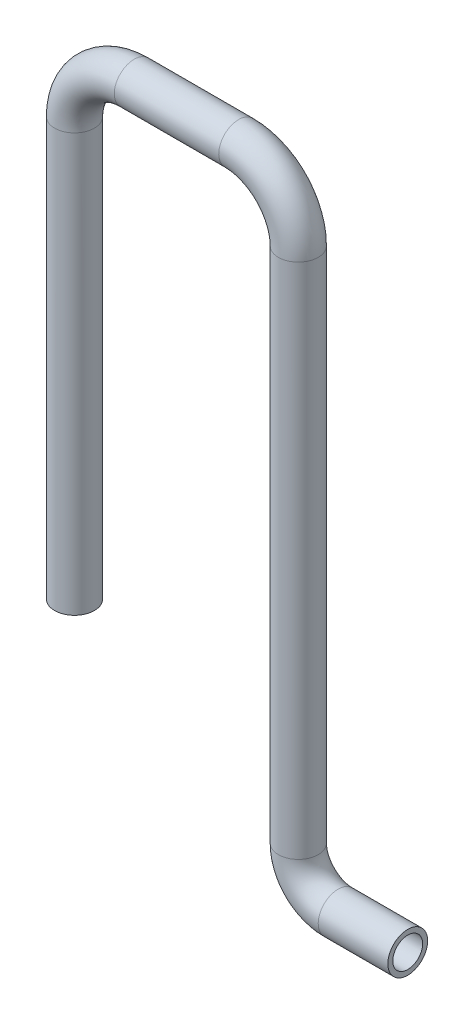
ISO-10303-21;
HEADER;
FILE_DESCRIPTION(('STEP AP214'),'2;1');
FILE_NAME('part.step','',(''),(''),'','','');
FILE_SCHEMA(('AUTOMOTIVE_DESIGN { 1 0 10303 214 1 1 1 1 }'));
ENDSEC;
DATA;
#1=APPLICATION_CONTEXT('core data for automotive mechanical design processes');
#2=APPLICATION_PROTOCOL_DEFINITION('international standard','automotive_design',2000,#1);
#3=PRODUCT_CONTEXT('',#1,'mechanical');
#4=PRODUCT('Part','Part','',(#3));
#5=PRODUCT_RELATED_PRODUCT_CATEGORY('part','',(#4));
#6=PRODUCT_DEFINITION_FORMATION('','',#4);
#7=PRODUCT_DEFINITION_CONTEXT('part definition',#1,'design');
#8=PRODUCT_DEFINITION('design','',#6,#7);
#9=PRODUCT_DEFINITION_SHAPE('','',#8);
#10=(LENGTH_UNIT() NAMED_UNIT(*) SI_UNIT(.MILLI.,.METRE.));
#11=(NAMED_UNIT(*) PLANE_ANGLE_UNIT() SI_UNIT($,.RADIAN.));
#12=(NAMED_UNIT(*) SI_UNIT($,.STERADIAN.) SOLID_ANGLE_UNIT());
#13=UNCERTAINTY_MEASURE_WITH_UNIT(LENGTH_MEASURE(1.E-05),#10,'distance_accuracy_value','');
#14=(GEOMETRIC_REPRESENTATION_CONTEXT(3) GLOBAL_UNCERTAINTY_ASSIGNED_CONTEXT((#13)) GLOBAL_UNIT_ASSIGNED_CONTEXT((#10,
#11,#12)) REPRESENTATION_CONTEXT('',''));
#15=CARTESIAN_POINT('',(0.,0.,0.));
#16=DIRECTION('',(0.,0.,1.));
#17=DIRECTION('',(1.,0.,0.));
#18=AXIS2_PLACEMENT_3D('',#15,#16,#17);
#19=CARTESIAN_POINT('',(-145.,44.,95.));
#20=DIRECTION('',(0.,-1.,0.));
#21=DIRECTION('',(0.,0.,1.));
#22=AXIS2_PLACEMENT_3D('',#19,#20,#21);
#23=PLANE('',#22);
#24=CARTESIAN_POINT('',(-145.,44.,95.));
#25=DIRECTION('',(0.,-1.,0.));
#26=DIRECTION('',(0.,0.,1.));
#27=AXIS2_PLACEMENT_3D('',#24,#25,#26);
#28=CIRCLE('',#27,3.);
#29=CARTESIAN_POINT('',(-145.,44.,98.));
#30=VERTEX_POINT('',#29);
#31=EDGE_CURVE('E263',#30,#30,#28,.T.);
#32=ORIENTED_EDGE('',*,*,#31,.F.);
#33=EDGE_LOOP('',(#32));
#34=FACE_BOUND('',#33,.T.);
#35=CARTESIAN_POINT('',(-145.,44.,95.));
#36=DIRECTION('',(0.,-1.,0.));
#37=DIRECTION('',(0.,0.,-1.));
#38=AXIS2_PLACEMENT_3D('',#35,#36,#37);
#39=CIRCLE('',#38,4.);
#40=CARTESIAN_POINT('',(-145.,44.,91.));
#41=VERTEX_POINT('',#40);
#42=EDGE_CURVE('E75',#41,#41,#39,.T.);
#43=ORIENTED_EDGE('',*,*,#42,.T.);
#44=EDGE_LOOP('',(#43));
#45=FACE_BOUND('',#44,.T.);
#46=ADVANCED_FACE('F52',(#34,#45),#23,.T.);
#47=CARTESIAN_POINT('',(-78.,16.,95.));
#48=DIRECTION('',(-1.,0.,0.));
#49=DIRECTION('',(0.,0.,1.));
#50=AXIS2_PLACEMENT_3D('',#47,#48,#49);
#51=PLANE('',#50);
#52=CARTESIAN_POINT('',(-78.,16.,95.));
#53=DIRECTION('',(-1.,0.,0.));
#54=DIRECTION('',(0.,0.,1.));
#55=AXIS2_PLACEMENT_3D('',#52,#53,#54);
#56=CIRCLE('',#55,3.);
#57=CARTESIAN_POINT('',(-78.,16.,98.));
#58=VERTEX_POINT('',#57);
#59=EDGE_CURVE('E73',#58,#58,#56,.T.);
#60=ORIENTED_EDGE('',*,*,#59,.T.);
#61=EDGE_LOOP('',(#60));
#62=FACE_BOUND('',#61,.T.);
#63=CARTESIAN_POINT('',(-78.,16.,95.));
#64=DIRECTION('',(-1.,0.,0.));
#65=DIRECTION('',(0.,0.,1.));
#66=AXIS2_PLACEMENT_3D('',#63,#64,#65);
#67=CIRCLE('',#66,4.);
#68=CARTESIAN_POINT('',(-78.,16.,99.));
#69=VERTEX_POINT('',#68);
#70=EDGE_CURVE('E11',#69,#69,#67,.T.);
#71=ORIENTED_EDGE('',*,*,#70,.F.);
#72=EDGE_LOOP('',(#71));
#73=FACE_BOUND('',#72,.T.);
#74=ADVANCED_FACE('F149',(#62,#73),#51,.F.);
#75=CARTESIAN_POINT('',(-145.,44.,95.));
#76=DIRECTION('',(0.,1.,0.));
#77=DIRECTION('',(0.,0.,1.));
#78=AXIS2_PLACEMENT_3D('',#75,#76,#77);
#79=CYLINDRICAL_SURFACE('',#78,4.);
#80=CARTESIAN_POINT('',(-145.,128.,95.));
#81=DIRECTION('',(0.,1.,0.));
#82=DIRECTION('',(0.,0.,1.));
#83=AXIS2_PLACEMENT_3D('',#80,#81,#82);
#84=CIRCLE('',#83,4.);
#85=CARTESIAN_POINT('',(-149.,128.,95.));
#86=VERTEX_POINT('',#85);
#87=EDGE_CURVE('E74',#86,#86,#84,.F.);
#88=ORIENTED_EDGE('',*,*,#87,.T.);
#89=EDGE_LOOP('',(#88));
#90=FACE_BOUND('',#89,.T.);
#91=ORIENTED_EDGE('',*,*,#42,.F.);
#92=EDGE_LOOP('',(#91));
#93=FACE_BOUND('',#92,.T.);
#94=ADVANCED_FACE('F155',(#90,#93),#79,.T.);
#95=CARTESIAN_POINT('',(-133.,128.,95.));
#96=DIRECTION('',(0.,0.,-1.));
#97=DIRECTION('',(-1.,0.,0.));
#98=AXIS2_PLACEMENT_3D('',#95,#96,#97);
#99=TOROIDAL_SURFACE('',#98,12.,4.);
#100=CARTESIAN_POINT('',(-133.,140.,95.));
#101=DIRECTION('',(-1.,0.,0.));
#102=DIRECTION('',(0.,-1.,0.));
#103=AXIS2_PLACEMENT_3D('',#100,#101,#102);
#104=CIRCLE('',#103,4.);
#105=CARTESIAN_POINT('',(-133.,144.,95.));
#106=VERTEX_POINT('',#105);
#107=EDGE_CURVE('E78',#106,#106,#104,.T.);
#108=CARTESIAN_POINT('',(-133.,128.,95.));
#109=DIRECTION('',(0.,0.,-1.));
#110=DIRECTION('',(-1.,0.,0.));
#111=AXIS2_PLACEMENT_3D('',#108,#109,#110);
#112=CIRCLE('',#111,16.);
#113=EDGE_CURVE('',#86,#106,#112,.T.);
#114=ORIENTED_EDGE('',*,*,#87,.F.);
#115=ORIENTED_EDGE('',*,*,#107,.T.);
#116=ORIENTED_EDGE('',*,*,#113,.T.);
#117=ORIENTED_EDGE('',*,*,#113,.F.);
#118=EDGE_LOOP('',(#114,#116,#115,#117));
#119=FACE_BOUND('',#118,.T.);
#120=ADVANCED_FACE('F158',(#119),#99,.T.);
#121=CARTESIAN_POINT('',(-133.,140.,95.));
#122=DIRECTION('',(1.,0.,0.));
#123=DIRECTION('',(0.,0.,-1.));
#124=AXIS2_PLACEMENT_3D('',#121,#122,#123);
#125=CYLINDRICAL_SURFACE('',#124,4.);
#126=CARTESIAN_POINT('',(-112.,140.,95.));
#127=DIRECTION('',(1.,0.,0.));
#128=DIRECTION('',(0.,0.,-1.));
#129=AXIS2_PLACEMENT_3D('',#126,#127,#128);
#130=CIRCLE('',#129,4.);
#131=CARTESIAN_POINT('',(-112.,144.,95.));
#132=VERTEX_POINT('',#131);
#133=EDGE_CURVE('E91',#132,#132,#130,.F.);
#134=ORIENTED_EDGE('',*,*,#133,.T.);
#135=EDGE_LOOP('',(#134));
#136=FACE_BOUND('',#135,.T.);
#137=ORIENTED_EDGE('',*,*,#107,.F.);
#138=EDGE_LOOP('',(#137));
#139=FACE_BOUND('',#138,.T.);
#140=ADVANCED_FACE('F109',(#136,#139),#125,.T.);
#141=CARTESIAN_POINT('',(-112.,128.,95.));
#142=DIRECTION('',(0.,0.,-1.));
#143=DIRECTION('',(-1.,0.,0.));
#144=AXIS2_PLACEMENT_3D('',#141,#142,#143);
#145=TOROIDAL_SURFACE('',#144,12.,4.);
#146=CARTESIAN_POINT('',(-100.,128.,95.));
#147=DIRECTION('',(0.,1.,0.));
#148=DIRECTION('',(-1.,0.,0.));
#149=AXIS2_PLACEMENT_3D('',#146,#147,#148);
#150=CIRCLE('',#149,4.);
#151=CARTESIAN_POINT('',(-96.,128.,95.));
#152=VERTEX_POINT('',#151);
#153=EDGE_CURVE('E67',#152,#152,#150,.T.);
#154=CARTESIAN_POINT('',(-112.,128.,95.));
#155=DIRECTION('',(0.,0.,-1.));
#156=DIRECTION('',(-1.,0.,0.));
#157=AXIS2_PLACEMENT_3D('',#154,#155,#156);
#158=CIRCLE('',#157,16.);
#159=EDGE_CURVE('',#132,#152,#158,.T.);
#160=ORIENTED_EDGE('',*,*,#133,.F.);
#161=ORIENTED_EDGE('',*,*,#153,.T.);
#162=ORIENTED_EDGE('',*,*,#159,.T.);
#163=ORIENTED_EDGE('',*,*,#159,.F.);
#164=EDGE_LOOP('',(#160,#162,#161,#163));
#165=FACE_BOUND('',#164,.T.);
#166=ADVANCED_FACE('F98',(#165),#145,.T.);
#167=CARTESIAN_POINT('',(-100.,128.,95.));
#168=DIRECTION('',(0.,-1.,0.));
#169=DIRECTION('',(0.,0.,-1.));
#170=AXIS2_PLACEMENT_3D('',#167,#168,#169);
#171=CYLINDRICAL_SURFACE('',#170,4.);
#172=CARTESIAN_POINT('',(-100.,24.,95.));
#173=DIRECTION('',(0.,-1.,0.));
#174=DIRECTION('',(0.,0.,-1.));
#175=AXIS2_PLACEMENT_3D('',#172,#173,#174);
#176=CIRCLE('',#175,4.);
#177=CARTESIAN_POINT('',(-104.,24.,95.));
#178=VERTEX_POINT('',#177);
#179=EDGE_CURVE('E63',#178,#178,#176,.F.);
#180=ORIENTED_EDGE('',*,*,#179,.T.);
#181=EDGE_LOOP('',(#180));
#182=FACE_BOUND('',#181,.T.);
#183=ORIENTED_EDGE('',*,*,#153,.F.);
#184=EDGE_LOOP('',(#183));
#185=FACE_BOUND('',#184,.T.);
#186=ADVANCED_FACE('F101',(#182,#185),#171,.T.);
#187=CARTESIAN_POINT('',(-92.,24.,95.));
#188=DIRECTION('',(0.,0.,1.));
#189=DIRECTION('',(1.,0.,0.));
#190=AXIS2_PLACEMENT_3D('',#187,#188,#189);
#191=TOROIDAL_SURFACE('',#190,8.00000000000001,4.);
#192=CARTESIAN_POINT('',(-92.,16.,95.));
#193=DIRECTION('',(-1.,0.,0.));
#194=DIRECTION('',(0.,-1.,0.));
#195=AXIS2_PLACEMENT_3D('',#192,#193,#194);
#196=CIRCLE('',#195,4.);
#197=CARTESIAN_POINT('',(-92.,12.,95.));
#198=VERTEX_POINT('',#197);
#199=EDGE_CURVE('E58',#198,#198,#196,.T.);
#200=CARTESIAN_POINT('',(-92.,24.,95.));
#201=DIRECTION('',(0.,0.,1.));
#202=DIRECTION('',(1.,0.,0.));
#203=AXIS2_PLACEMENT_3D('',#200,#201,#202);
#204=CIRCLE('',#203,12.);
#205=EDGE_CURVE('',#178,#198,#204,.T.);
#206=ORIENTED_EDGE('',*,*,#179,.F.);
#207=ORIENTED_EDGE('',*,*,#199,.T.);
#208=ORIENTED_EDGE('',*,*,#205,.T.);
#209=ORIENTED_EDGE('',*,*,#205,.F.);
#210=EDGE_LOOP('',(#206,#208,#207,#209));
#211=FACE_BOUND('',#210,.T.);
#212=ADVANCED_FACE('F103',(#211),#191,.T.);
#213=CARTESIAN_POINT('',(-92.,16.,95.));
#214=DIRECTION('',(1.,0.,0.));
#215=DIRECTION('',(0.,0.,-1.));
#216=AXIS2_PLACEMENT_3D('',#213,#214,#215);
#217=CYLINDRICAL_SURFACE('',#216,4.);
#218=ORIENTED_EDGE('',*,*,#70,.T.);
#219=EDGE_LOOP('',(#218));
#220=FACE_BOUND('',#219,.T.);
#221=ORIENTED_EDGE('',*,*,#199,.F.);
#222=EDGE_LOOP('',(#221));
#223=FACE_BOUND('',#222,.T.);
#224=ADVANCED_FACE('F54',(#220,#223),#217,.T.);
#225=CARTESIAN_POINT('',(-145.,44.,95.));
#226=DIRECTION('',(0.,1.,0.));
#227=DIRECTION('',(0.,0.,1.));
#228=AXIS2_PLACEMENT_3D('',#225,#226,#227);
#229=CYLINDRICAL_SURFACE('',#228,3.);
#230=CARTESIAN_POINT('',(-145.,128.,95.));
#231=DIRECTION('',(0.,-1.,0.));
#232=DIRECTION('',(0.,0.,1.));
#233=AXIS2_PLACEMENT_3D('',#230,#231,#232);
#234=CIRCLE('',#233,3.);
#235=CARTESIAN_POINT('',(-148.,128.,95.));
#236=VERTEX_POINT('',#235);
#237=EDGE_CURVE('E262',#236,#236,#234,.T.);
#238=ORIENTED_EDGE('',*,*,#237,.F.);
#239=EDGE_LOOP('',(#238));
#240=FACE_BOUND('',#239,.T.);
#241=ORIENTED_EDGE('',*,*,#31,.T.);
#242=EDGE_LOOP('',(#241));
#243=FACE_BOUND('',#242,.T.);
#244=ADVANCED_FACE('F114',(#240,#243),#229,.F.);
#245=CARTESIAN_POINT('',(-133.,128.,95.));
#246=DIRECTION('',(0.,0.,-1.));
#247=DIRECTION('',(-1.,0.,0.));
#248=AXIS2_PLACEMENT_3D('',#245,#246,#247);
#249=TOROIDAL_SURFACE('',#248,12.,3.);
#250=CARTESIAN_POINT('',(-133.,140.,95.));
#251=DIRECTION('',(-1.,0.,0.));
#252=DIRECTION('',(0.,0.,1.));
#253=AXIS2_PLACEMENT_3D('',#250,#251,#252);
#254=CIRCLE('',#253,3.);
#255=CARTESIAN_POINT('',(-133.,143.,95.));
#256=VERTEX_POINT('',#255);
#257=EDGE_CURVE('E270',#256,#256,#254,.T.);
#258=CARTESIAN_POINT('',(-133.,128.,95.));
#259=DIRECTION('',(0.,0.,-1.));
#260=DIRECTION('',(-1.,0.,0.));
#261=AXIS2_PLACEMENT_3D('',#258,#259,#260);
#262=CIRCLE('',#261,15.);
#263=EDGE_CURVE('',#236,#256,#262,.T.);
#264=ORIENTED_EDGE('',*,*,#237,.T.);
#265=ORIENTED_EDGE('',*,*,#257,.F.);
#266=ORIENTED_EDGE('',*,*,#263,.T.);
#267=ORIENTED_EDGE('',*,*,#263,.F.);
#268=EDGE_LOOP('',(#264,#266,#265,#267));
#269=FACE_BOUND('',#268,.T.);
#270=ADVANCED_FACE('F120',(#269),#249,.F.);
#271=CARTESIAN_POINT('',(-133.,140.,95.));
#272=DIRECTION('',(1.,0.,0.));
#273=DIRECTION('',(0.,0.,-1.));
#274=AXIS2_PLACEMENT_3D('',#271,#272,#273);
#275=CYLINDRICAL_SURFACE('',#274,3.);
#276=CARTESIAN_POINT('',(-112.,140.,95.));
#277=DIRECTION('',(-1.,0.,0.));
#278=DIRECTION('',(0.,0.,1.));
#279=AXIS2_PLACEMENT_3D('',#276,#277,#278);
#280=CIRCLE('',#279,3.);
#281=CARTESIAN_POINT('',(-112.,143.,95.));
#282=VERTEX_POINT('',#281);
#283=EDGE_CURVE('E275',#282,#282,#280,.T.);
#284=ORIENTED_EDGE('',*,*,#283,.F.);
#285=EDGE_LOOP('',(#284));
#286=FACE_BOUND('',#285,.T.);
#287=ORIENTED_EDGE('',*,*,#257,.T.);
#288=EDGE_LOOP('',(#287));
#289=FACE_BOUND('',#288,.T.);
#290=ADVANCED_FACE('F122',(#286,#289),#275,.F.);
#291=CARTESIAN_POINT('',(-112.,128.,95.));
#292=DIRECTION('',(0.,0.,-1.));
#293=DIRECTION('',(-1.,0.,0.));
#294=AXIS2_PLACEMENT_3D('',#291,#292,#293);
#295=TOROIDAL_SURFACE('',#294,12.,3.);
#296=CARTESIAN_POINT('',(-100.,128.,95.));
#297=DIRECTION('',(0.,1.,0.));
#298=DIRECTION('',(0.,0.,1.));
#299=AXIS2_PLACEMENT_3D('',#296,#297,#298);
#300=CIRCLE('',#299,3.);
#301=CARTESIAN_POINT('',(-97.,128.,95.));
#302=VERTEX_POINT('',#301);
#303=EDGE_CURVE('E274',#302,#302,#300,.T.);
#304=CARTESIAN_POINT('',(-112.,128.,95.));
#305=DIRECTION('',(0.,0.,-1.));
#306=DIRECTION('',(-1.,0.,0.));
#307=AXIS2_PLACEMENT_3D('',#304,#305,#306);
#308=CIRCLE('',#307,15.);
#309=EDGE_CURVE('',#282,#302,#308,.T.);
#310=ORIENTED_EDGE('',*,*,#283,.T.);
#311=ORIENTED_EDGE('',*,*,#303,.F.);
#312=ORIENTED_EDGE('',*,*,#309,.T.);
#313=ORIENTED_EDGE('',*,*,#309,.F.);
#314=EDGE_LOOP('',(#310,#312,#311,#313));
#315=FACE_BOUND('',#314,.T.);
#316=ADVANCED_FACE('F135',(#315),#295,.F.);
#317=CARTESIAN_POINT('',(-100.,128.,95.));
#318=DIRECTION('',(0.,-1.,0.));
#319=DIRECTION('',(0.,0.,-1.));
#320=AXIS2_PLACEMENT_3D('',#317,#318,#319);
#321=CYLINDRICAL_SURFACE('',#320,3.);
#322=CARTESIAN_POINT('',(-100.,24.,95.));
#323=DIRECTION('',(0.,1.,0.));
#324=DIRECTION('',(0.,0.,1.));
#325=AXIS2_PLACEMENT_3D('',#322,#323,#324);
#326=CIRCLE('',#325,3.);
#327=CARTESIAN_POINT('',(-103.,24.,95.));
#328=VERTEX_POINT('',#327);
#329=EDGE_CURVE('E87',#328,#328,#326,.T.);
#330=ORIENTED_EDGE('',*,*,#329,.F.);
#331=EDGE_LOOP('',(#330));
#332=FACE_BOUND('',#331,.T.);
#333=ORIENTED_EDGE('',*,*,#303,.T.);
#334=EDGE_LOOP('',(#333));
#335=FACE_BOUND('',#334,.T.);
#336=ADVANCED_FACE('F136',(#332,#335),#321,.F.);
#337=CARTESIAN_POINT('',(-92.,24.,95.));
#338=DIRECTION('',(0.,0.,1.));
#339=DIRECTION('',(1.,0.,0.));
#340=AXIS2_PLACEMENT_3D('',#337,#338,#339);
#341=TOROIDAL_SURFACE('',#340,8.00000000000001,3.);
#342=CARTESIAN_POINT('',(-92.,16.,95.));
#343=DIRECTION('',(-1.,0.,0.));
#344=DIRECTION('',(0.,0.,1.));
#345=AXIS2_PLACEMENT_3D('',#342,#343,#344);
#346=CIRCLE('',#345,3.);
#347=CARTESIAN_POINT('',(-92.,13.,95.));
#348=VERTEX_POINT('',#347);
#349=EDGE_CURVE('E85',#348,#348,#346,.T.);
#350=CARTESIAN_POINT('',(-92.,24.,95.));
#351=DIRECTION('',(0.,0.,1.));
#352=DIRECTION('',(1.,0.,0.));
#353=AXIS2_PLACEMENT_3D('',#350,#351,#352);
#354=CIRCLE('',#353,11.);
#355=EDGE_CURVE('',#328,#348,#354,.T.);
#356=ORIENTED_EDGE('',*,*,#329,.T.);
#357=ORIENTED_EDGE('',*,*,#349,.F.);
#358=ORIENTED_EDGE('',*,*,#355,.T.);
#359=ORIENTED_EDGE('',*,*,#355,.F.);
#360=EDGE_LOOP('',(#356,#358,#357,#359));
#361=FACE_BOUND('',#360,.T.);
#362=ADVANCED_FACE('F139',(#361),#341,.F.);
#363=CARTESIAN_POINT('',(-92.,16.,95.));
#364=DIRECTION('',(1.,0.,0.));
#365=DIRECTION('',(0.,0.,-1.));
#366=AXIS2_PLACEMENT_3D('',#363,#364,#365);
#367=CYLINDRICAL_SURFACE('',#366,3.);
#368=ORIENTED_EDGE('',*,*,#59,.F.);
#369=EDGE_LOOP('',(#368));
#370=FACE_BOUND('',#369,.T.);
#371=ORIENTED_EDGE('',*,*,#349,.T.);
#372=EDGE_LOOP('',(#371));
#373=FACE_BOUND('',#372,.T.);
#374=ADVANCED_FACE('F145',(#370,#373),#367,.F.);
#375=CLOSED_SHELL('',(#46,#74,#94,#120,#140,#166,#186,#212,#224,#244,#270,#290,#316,#336,#362,#374));
#376=MANIFOLD_SOLID_BREP('B2',#375);
#377=ADVANCED_BREP_SHAPE_REPRESENTATION('',(#18,#376),#14);
#378=SHAPE_DEFINITION_REPRESENTATION(#9,#377);
ENDSEC;
END-ISO-10303-21;
